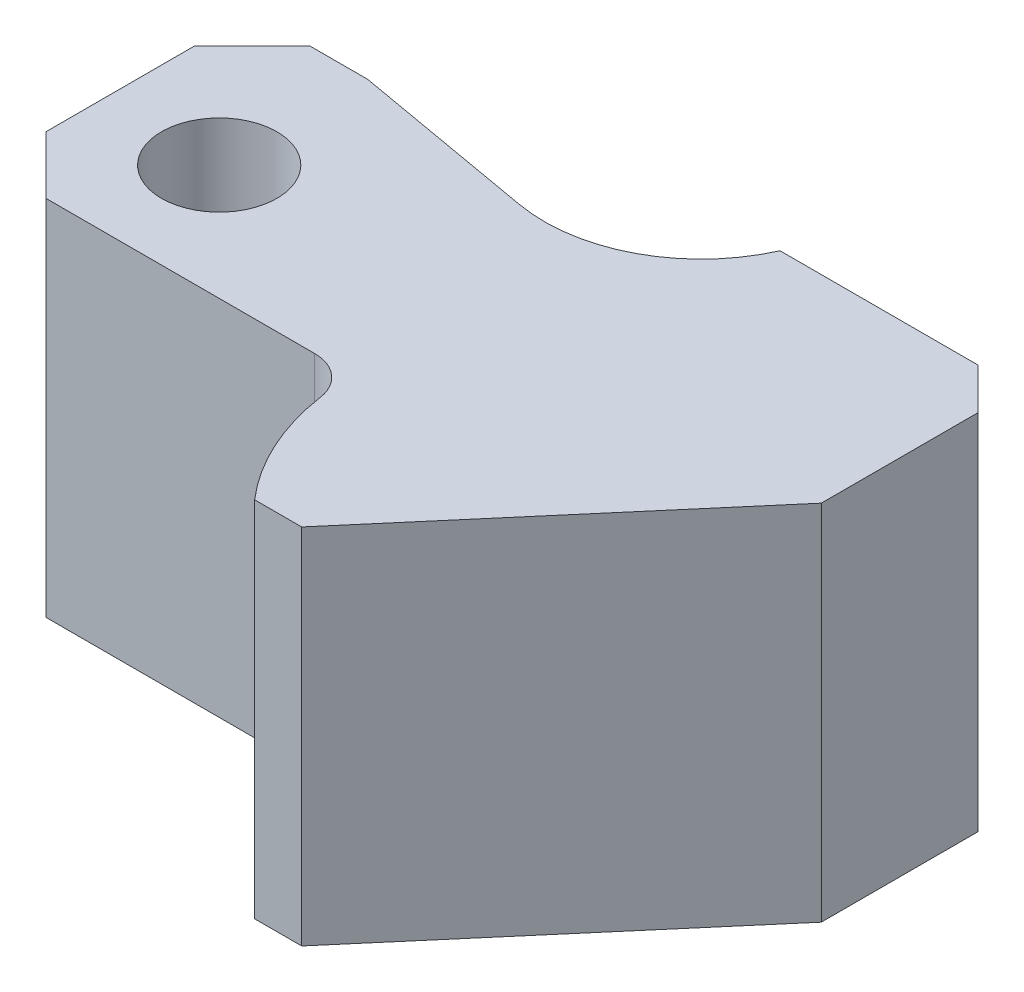
ISO-10303-21;
HEADER;
FILE_DESCRIPTION(('STEP AP214'),'2;1');
FILE_NAME('part.step','',(''),(''),'','','');
FILE_SCHEMA(('AUTOMOTIVE_DESIGN { 1 0 10303 214 1 1 1 1 }'));
ENDSEC;
DATA;
#1=APPLICATION_CONTEXT('core data for automotive mechanical design processes');
#2=APPLICATION_PROTOCOL_DEFINITION('international standard','automotive_design',2000,#1);
#3=PRODUCT_CONTEXT('',#1,'mechanical');
#4=PRODUCT('Part','Part','',(#3));
#5=PRODUCT_RELATED_PRODUCT_CATEGORY('part','',(#4));
#6=PRODUCT_DEFINITION_FORMATION('','',#4);
#7=PRODUCT_DEFINITION_CONTEXT('part definition',#1,'design');
#8=PRODUCT_DEFINITION('design','',#6,#7);
#9=PRODUCT_DEFINITION_SHAPE('','',#8);
#10=(LENGTH_UNIT() NAMED_UNIT(*) SI_UNIT(.MILLI.,.METRE.));
#11=(NAMED_UNIT(*) PLANE_ANGLE_UNIT() SI_UNIT($,.RADIAN.));
#12=(NAMED_UNIT(*) SI_UNIT($,.STERADIAN.) SOLID_ANGLE_UNIT());
#13=UNCERTAINTY_MEASURE_WITH_UNIT(LENGTH_MEASURE(1.E-05),#10,'distance_accuracy_value','');
#14=(GEOMETRIC_REPRESENTATION_CONTEXT(3) GLOBAL_UNCERTAINTY_ASSIGNED_CONTEXT((#13)) GLOBAL_UNIT_ASSIGNED_CONTEXT((#10,
#11,#12)) REPRESENTATION_CONTEXT('',''));
#15=CARTESIAN_POINT('',(0.,0.,0.));
#16=DIRECTION('',(0.,0.,1.));
#17=DIRECTION('',(1.,0.,0.));
#18=AXIS2_PLACEMENT_3D('',#15,#16,#17);
#19=CARTESIAN_POINT('',(31.6158709506115,22.,-36.5570863649439));
#20=DIRECTION('',(0.,1.,0.));
#21=DIRECTION('',(0.,0.,1.));
#22=AXIS2_PLACEMENT_3D('',#19,#20,#21);
#23=PLANE('',#22);
#24=DIRECTION('',(-0.984807753012208,0.,-0.173648177666931));
#25=VECTOR('',#24,1.);
#26=CARTESIAN_POINT('',(5.95517473916279,22.,-21.7886538249566));
#27=LINE('',#26,#25);
#28=CARTESIAN_POINT('',(28.3165555749399,22.,-17.8457390577119));
#29=VERTEX_POINT('',#28);
#30=CARTESIAN_POINT('',(5.95517473916279,22.,-21.7886538249566));
#31=VERTEX_POINT('',#30);
#32=EDGE_CURVE('E203',#29,#31,#27,.T.);
#33=ORIENTED_EDGE('',*,*,#32,.T.);
#34=DIRECTION('',(-1.,0.,0.));
#35=VECTOR('',#34,1.);
#36=CARTESIAN_POINT('',(-1.04482526083724,22.,-21.7886538249566));
#37=LINE('',#36,#35);
#38=CARTESIAN_POINT('',(-1.04482526083724,22.,-21.7886538249566));
#39=VERTEX_POINT('',#38);
#40=EDGE_CURVE('E121',#31,#39,#37,.T.);
#41=ORIENTED_EDGE('',*,*,#40,.T.);
#42=DIRECTION('',(-0.707106781186546,0.,0.707106781186549));
#43=VECTOR('',#42,1.);
#44=CARTESIAN_POINT('',(-8.04482526083721,22.,-14.7886538249566));
#45=LINE('',#44,#43);
#46=CARTESIAN_POINT('',(-8.04482526083721,22.,-14.7886538249566));
#47=VERTEX_POINT('',#46);
#48=EDGE_CURVE('E236',#39,#47,#45,.T.);
#49=ORIENTED_EDGE('',*,*,#48,.T.);
#50=DIRECTION('',(0.,0.,1.));
#51=VECTOR('',#50,1.);
#52=CARTESIAN_POINT('',(-8.04482526083721,22.,3.21134617504336));
#53=LINE('',#52,#51);
#54=CARTESIAN_POINT('',(-8.04482526083721,22.,3.21134617504336));
#55=VERTEX_POINT('',#54);
#56=EDGE_CURVE('E255',#47,#55,#53,.T.);
#57=ORIENTED_EDGE('',*,*,#56,.T.);
#58=DIRECTION('',(0.707106781186546,0.,0.707106781186549));
#59=VECTOR('',#58,1.);
#60=CARTESIAN_POINT('',(-1.04482526083724,22.,10.2113461750434));
#61=LINE('',#60,#59);
#62=CARTESIAN_POINT('',(-1.04482526083724,22.,10.2113461750434));
#63=VERTEX_POINT('',#62);
#64=EDGE_CURVE('E252',#55,#63,#61,.T.);
#65=ORIENTED_EDGE('',*,*,#64,.T.);
#66=DIRECTION('',(1.,0.,0.));
#67=VECTOR('',#66,1.);
#68=CARTESIAN_POINT('',(-1.04482526083724,22.,10.2113461750434));
#69=LINE('',#68,#67);
#70=CARTESIAN_POINT('',(31.5307136505035,22.,10.2113461750434));
#71=VERTEX_POINT('',#70);
#72=EDGE_CURVE('E254',#63,#71,#69,.T.);
#73=ORIENTED_EDGE('',*,*,#72,.T.);
#74=CARTESIAN_POINT('',(31.5307136505035,22.,15.2113461750434));
#75=DIRECTION('',(0.,-1.,0.));
#76=DIRECTION('',(0.,0.,-1.));
#77=AXIS2_PLACEMENT_3D('',#74,#75,#76);
#78=CIRCLE('',#77,5.);
#79=CARTESIAN_POINT('',(36.4763523919153,22.,14.4760520573963));
#80=VERTEX_POINT('',#79);
#81=EDGE_CURVE('E257',#71,#80,#78,.T.);
#82=ORIENTED_EDGE('',*,*,#81,.T.);
#83=CARTESIAN_POINT('',(65.1610570921039,22.,10.2113461750434));
#84=DIRECTION('',(0.,1.,0.));
#85=DIRECTION('',(0.,0.,1.));
#86=AXIS2_PLACEMENT_3D('',#83,#84,#85);
#87=CIRCLE('',#86,29.);
#88=CARTESIAN_POINT('',(43.2521547918973,22.,29.2113461750434));
#89=VERTEX_POINT('',#88);
#90=EDGE_CURVE('E263',#80,#89,#87,.T.);
#91=ORIENTED_EDGE('',*,*,#90,.T.);
#92=DIRECTION('',(1.,0.,0.));
#93=VECTOR('',#92,1.);
#94=CARTESIAN_POINT('',(43.2521547918973,22.,29.2113461750434));
#95=LINE('',#94,#93);
#96=CARTESIAN_POINT('',(48.9551747391628,22.,29.2113461750434));
#97=VERTEX_POINT('',#96);
#98=EDGE_CURVE('E265',#89,#97,#95,.T.);
#99=ORIENTED_EDGE('',*,*,#98,.T.);
#100=DIRECTION('',(0.64894660608275,0.,-0.760833951959086));
#101=VECTOR('',#100,1.);
#102=CARTESIAN_POINT('',(48.9551747391628,22.,29.2113461750434));
#103=LINE('',#102,#101);
#104=CARTESIAN_POINT('',(77.9551747391628,22.,-4.78865382495664));
#105=VERTEX_POINT('',#104);
#106=EDGE_CURVE('E267',#97,#105,#103,.T.);
#107=ORIENTED_EDGE('',*,*,#106,.T.);
#108=DIRECTION('',(0.,0.,-1.));
#109=VECTOR('',#108,1.);
#110=CARTESIAN_POINT('',(77.9551747391628,22.,-23.7886538249566));
#111=LINE('',#110,#109);
#112=CARTESIAN_POINT('',(77.9551747391628,22.,-23.7886538249566));
#113=VERTEX_POINT('',#112);
#114=EDGE_CURVE('E158',#105,#113,#111,.T.);
#115=ORIENTED_EDGE('',*,*,#114,.T.);
#116=DIRECTION('',(-0.707106781186548,0.,-0.707106781186547));
#117=VECTOR('',#116,1.);
#118=CARTESIAN_POINT('',(72.9551747391628,22.,-28.7886538249566));
#119=LINE('',#118,#117);
#120=CARTESIAN_POINT('',(72.9551747391628,22.,-28.7886538249566));
#121=VERTEX_POINT('',#120);
#122=EDGE_CURVE('E152',#113,#121,#119,.T.);
#123=ORIENTED_EDGE('',*,*,#122,.T.);
#124=DIRECTION('',(-1.,0.,0.));
#125=VECTOR('',#124,1.);
#126=CARTESIAN_POINT('',(48.9551747391628,22.,-28.7886538249566));
#127=LINE('',#126,#125);
#128=CARTESIAN_POINT('',(48.9551747391628,22.,-28.7886538249566));
#129=VERTEX_POINT('',#128);
#130=EDGE_CURVE('E156',#121,#129,#127,.T.);
#131=ORIENTED_EDGE('',*,*,#130,.T.);
#132=CARTESIAN_POINT('',(31.6158709506115,22.,-36.5570863649439));
#133=DIRECTION('',(0.,-1.,0.));
#134=DIRECTION('',(0.,0.,1.));
#135=AXIS2_PLACEMENT_3D('',#132,#133,#134);
#136=CIRCLE('',#135,19.);
#137=EDGE_CURVE('E60',#129,#29,#136,.T.);
#138=ORIENTED_EDGE('',*,*,#137,.T.);
#139=EDGE_LOOP('',(#33,#41,#49,#57,#65,#73,#82,#91,#99,#107,#115,#123,#131,#138));
#140=FACE_BOUND('',#139,.T.);
#141=CARTESIAN_POINT('',(5.95517473916279,22.,-3.78865382495664));
#142=DIRECTION('',(0.,1.,0.));
#143=DIRECTION('',(0.,0.,1.));
#144=AXIS2_PLACEMENT_3D('',#141,#142,#143);
#145=CIRCLE('',#144,7.);
#146=CARTESIAN_POINT('',(5.95517473916279,22.,3.21134617504336));
#147=VERTEX_POINT('',#146);
#148=EDGE_CURVE('E180',#147,#147,#145,.T.);
#149=ORIENTED_EDGE('',*,*,#148,.F.);
#150=EDGE_LOOP('',(#149));
#151=FACE_BOUND('',#150,.T.);
#152=ADVANCED_FACE('F43',(#140,#151),#23,.T.);
#153=CARTESIAN_POINT('',(31.6158709506115,-22.,-36.5570863649439));
#154=DIRECTION('',(0.,1.,0.));
#155=DIRECTION('',(0.,0.,1.));
#156=AXIS2_PLACEMENT_3D('',#153,#154,#155);
#157=PLANE('',#156);
#158=DIRECTION('',(-0.984807753012208,0.,-0.173648177666931));
#159=VECTOR('',#158,1.);
#160=CARTESIAN_POINT('',(5.95517473916279,-22.,-21.7886538249566));
#161=LINE('',#160,#159);
#162=CARTESIAN_POINT('',(28.3165555749399,-22.,-17.8457390577119));
#163=VERTEX_POINT('',#162);
#164=CARTESIAN_POINT('',(5.95517473916279,-22.,-21.7886538249566));
#165=VERTEX_POINT('',#164);
#166=EDGE_CURVE('E176',#163,#165,#161,.T.);
#167=ORIENTED_EDGE('',*,*,#166,.F.);
#168=CARTESIAN_POINT('',(31.6158709506115,-22.,-36.5570863649439));
#169=DIRECTION('',(0.,-1.,0.));
#170=DIRECTION('',(0.,0.,1.));
#171=AXIS2_PLACEMENT_3D('',#168,#169,#170);
#172=CIRCLE('',#171,19.);
#173=CARTESIAN_POINT('',(48.9551747391628,-22.,-28.7886538249566));
#174=VERTEX_POINT('',#173);
#175=EDGE_CURVE('E113',#174,#163,#172,.T.);
#176=ORIENTED_EDGE('',*,*,#175,.F.);
#177=DIRECTION('',(-1.,0.,0.));
#178=VECTOR('',#177,1.);
#179=CARTESIAN_POINT('',(48.9551747391628,-22.,-28.7886538249566));
#180=LINE('',#179,#178);
#181=CARTESIAN_POINT('',(72.9551747391628,-22.,-28.7886538249566));
#182=VERTEX_POINT('',#181);
#183=EDGE_CURVE('E107',#182,#174,#180,.T.);
#184=ORIENTED_EDGE('',*,*,#183,.F.);
#185=DIRECTION('',(-0.707106781186548,0.,-0.707106781186547));
#186=VECTOR('',#185,1.);
#187=CARTESIAN_POINT('',(72.9551747391628,-22.,-28.7886538249566));
#188=LINE('',#187,#186);
#189=CARTESIAN_POINT('',(77.9551747391628,-22.,-23.7886538249566));
#190=VERTEX_POINT('',#189);
#191=EDGE_CURVE('E166',#190,#182,#188,.T.);
#192=ORIENTED_EDGE('',*,*,#191,.F.);
#193=DIRECTION('',(0.,0.,-1.));
#194=VECTOR('',#193,1.);
#195=CARTESIAN_POINT('',(77.9551747391628,-22.,-23.7886538249566));
#196=LINE('',#195,#194);
#197=CARTESIAN_POINT('',(77.9551747391628,-22.,-4.78865382495664));
#198=VERTEX_POINT('',#197);
#199=EDGE_CURVE('E198',#198,#190,#196,.T.);
#200=ORIENTED_EDGE('',*,*,#199,.F.);
#201=DIRECTION('',(0.64894660608275,0.,-0.760833951959086));
#202=VECTOR('',#201,1.);
#203=CARTESIAN_POINT('',(48.9551747391628,-22.,29.2113461750434));
#204=LINE('',#203,#202);
#205=CARTESIAN_POINT('',(48.9551747391628,-22.,29.2113461750434));
#206=VERTEX_POINT('',#205);
#207=EDGE_CURVE('E196',#206,#198,#204,.T.);
#208=ORIENTED_EDGE('',*,*,#207,.F.);
#209=DIRECTION('',(1.,0.,0.));
#210=VECTOR('',#209,1.);
#211=CARTESIAN_POINT('',(43.2521547918973,-22.,29.2113461750434));
#212=LINE('',#211,#210);
#213=CARTESIAN_POINT('',(43.2521547918973,-22.,29.2113461750434));
#214=VERTEX_POINT('',#213);
#215=EDGE_CURVE('E194',#214,#206,#212,.T.);
#216=ORIENTED_EDGE('',*,*,#215,.F.);
#217=CARTESIAN_POINT('',(65.1610570921039,-22.,10.2113461750434));
#218=DIRECTION('',(0.,1.,0.));
#219=DIRECTION('',(0.,0.,1.));
#220=AXIS2_PLACEMENT_3D('',#217,#218,#219);
#221=CIRCLE('',#220,29.);
#222=CARTESIAN_POINT('',(36.4763523919153,-22.,14.4760520573963));
#223=VERTEX_POINT('',#222);
#224=EDGE_CURVE('E192',#223,#214,#221,.T.);
#225=ORIENTED_EDGE('',*,*,#224,.F.);
#226=CARTESIAN_POINT('',(31.5307136505035,-22.,15.2113461750434));
#227=DIRECTION('',(0.,-1.,0.));
#228=DIRECTION('',(0.,0.,-1.));
#229=AXIS2_PLACEMENT_3D('',#226,#227,#228);
#230=CIRCLE('',#229,5.);
#231=CARTESIAN_POINT('',(31.5307136505035,-22.,10.2113461750434));
#232=VERTEX_POINT('',#231);
#233=EDGE_CURVE('E190',#232,#223,#230,.T.);
#234=ORIENTED_EDGE('',*,*,#233,.F.);
#235=DIRECTION('',(1.,0.,0.));
#236=VECTOR('',#235,1.);
#237=CARTESIAN_POINT('',(-1.04482526083724,-22.,10.2113461750434));
#238=LINE('',#237,#236);
#239=CARTESIAN_POINT('',(-1.04482526083724,-22.,10.2113461750434));
#240=VERTEX_POINT('',#239);
#241=EDGE_CURVE('E188',#240,#232,#238,.T.);
#242=ORIENTED_EDGE('',*,*,#241,.F.);
#243=DIRECTION('',(0.707106781186546,0.,0.707106781186549));
#244=VECTOR('',#243,1.);
#245=CARTESIAN_POINT('',(-1.04482526083724,-22.,10.2113461750434));
#246=LINE('',#245,#244);
#247=CARTESIAN_POINT('',(-8.04482526083721,-22.,3.21134617504336));
#248=VERTEX_POINT('',#247);
#249=EDGE_CURVE('E186',#248,#240,#246,.T.);
#250=ORIENTED_EDGE('',*,*,#249,.F.);
#251=DIRECTION('',(0.,0.,1.));
#252=VECTOR('',#251,1.);
#253=CARTESIAN_POINT('',(-8.04482526083721,-22.,3.21134617504336));
#254=LINE('',#253,#252);
#255=CARTESIAN_POINT('',(-8.04482526083721,-22.,-14.7886538249566));
#256=VERTEX_POINT('',#255);
#257=EDGE_CURVE('E184',#256,#248,#254,.T.);
#258=ORIENTED_EDGE('',*,*,#257,.F.);
#259=DIRECTION('',(-0.707106781186546,0.,0.707106781186549));
#260=VECTOR('',#259,1.);
#261=CARTESIAN_POINT('',(-8.04482526083721,-22.,-14.7886538249566));
#262=LINE('',#261,#260);
#263=CARTESIAN_POINT('',(-1.04482526083724,-22.,-21.7886538249566));
#264=VERTEX_POINT('',#263);
#265=EDGE_CURVE('E182',#264,#256,#262,.T.);
#266=ORIENTED_EDGE('',*,*,#265,.F.);
#267=DIRECTION('',(-1.,0.,0.));
#268=VECTOR('',#267,1.);
#269=CARTESIAN_POINT('',(-1.04482526083724,-22.,-21.7886538249566));
#270=LINE('',#269,#268);
#271=EDGE_CURVE('E179',#165,#264,#270,.T.);
#272=ORIENTED_EDGE('',*,*,#271,.F.);
#273=EDGE_LOOP('',(#167,#176,#184,#192,#200,#208,#216,#225,#234,#242,#250,#258,#266,#272));
#274=FACE_BOUND('',#273,.T.);
#275=CARTESIAN_POINT('',(5.95517473916279,-22.,-3.78865382495664));
#276=DIRECTION('',(0.,1.,0.));
#277=DIRECTION('',(0.,0.,1.));
#278=AXIS2_PLACEMENT_3D('',#275,#276,#277);
#279=CIRCLE('',#278,7.);
#280=CARTESIAN_POINT('',(5.95517473916279,-22.,3.21134617504336));
#281=VERTEX_POINT('',#280);
#282=EDGE_CURVE('E440',#281,#281,#279,.T.);
#283=ORIENTED_EDGE('',*,*,#282,.T.);
#284=EDGE_LOOP('',(#283));
#285=FACE_BOUND('',#284,.T.);
#286=ADVANCED_FACE('F240',(#274,#285),#157,.F.);
#287=CARTESIAN_POINT('',(5.95517473916279,22.,-21.7886538249566));
#288=DIRECTION('',(-0.173648177666931,0.,0.984807753012208));
#289=DIRECTION('',(0.984807753012208,0.,0.173648177666931));
#290=AXIS2_PLACEMENT_3D('',#287,#288,#289);
#291=PLANE('',#290);
#292=ORIENTED_EDGE('',*,*,#166,.T.);
#293=DIRECTION('',(0.,-1.,0.));
#294=VECTOR('',#293,1.);
#295=CARTESIAN_POINT('',(5.95517473916279,22.,-21.7886538249566));
#296=LINE('',#295,#294);
#297=EDGE_CURVE('E11',#31,#165,#296,.T.);
#298=ORIENTED_EDGE('',*,*,#297,.F.);
#299=ORIENTED_EDGE('',*,*,#32,.F.);
#300=DIRECTION('',(0.,-1.,0.));
#301=VECTOR('',#300,1.);
#302=CARTESIAN_POINT('',(28.3165555749399,22.,-17.8457390577119));
#303=LINE('',#302,#301);
#304=EDGE_CURVE('E172',#29,#163,#303,.T.);
#305=ORIENTED_EDGE('',*,*,#304,.T.);
#306=EDGE_LOOP('',(#292,#298,#299,#305));
#307=FACE_BOUND('',#306,.T.);
#308=ADVANCED_FACE('F45',(#307),#291,.F.);
#309=CARTESIAN_POINT('',(-1.04482526083724,22.,-21.7886538249566));
#310=DIRECTION('',(0.,0.,1.));
#311=DIRECTION('',(1.,0.,0.));
#312=AXIS2_PLACEMENT_3D('',#309,#310,#311);
#313=PLANE('',#312);
#314=ORIENTED_EDGE('',*,*,#271,.T.);
#315=DIRECTION('',(0.,-1.,0.));
#316=VECTOR('',#315,1.);
#317=CARTESIAN_POINT('',(-1.04482526083724,22.,-21.7886538249566));
#318=LINE('',#317,#316);
#319=EDGE_CURVE('E52',#39,#264,#318,.T.);
#320=ORIENTED_EDGE('',*,*,#319,.F.);
#321=ORIENTED_EDGE('',*,*,#40,.F.);
#322=ORIENTED_EDGE('',*,*,#297,.T.);
#323=EDGE_LOOP('',(#314,#320,#321,#322));
#324=FACE_BOUND('',#323,.T.);
#325=ADVANCED_FACE('F301',(#324),#313,.F.);
#326=CARTESIAN_POINT('',(-8.04482526083721,22.,-14.7886538249566));
#327=DIRECTION('',(0.707106781186549,0.,0.707106781186546));
#328=DIRECTION('',(0.707106781186546,0.,-0.707106781186549));
#329=AXIS2_PLACEMENT_3D('',#326,#327,#328);
#330=PLANE('',#329);
#331=ORIENTED_EDGE('',*,*,#265,.T.);
#332=DIRECTION('',(0.,-1.,0.));
#333=VECTOR('',#332,1.);
#334=CARTESIAN_POINT('',(-8.04482526083721,22.,-14.7886538249566));
#335=LINE('',#334,#333);
#336=EDGE_CURVE('E228',#47,#256,#335,.T.);
#337=ORIENTED_EDGE('',*,*,#336,.F.);
#338=ORIENTED_EDGE('',*,*,#48,.F.);
#339=ORIENTED_EDGE('',*,*,#319,.T.);
#340=EDGE_LOOP('',(#331,#337,#338,#339));
#341=FACE_BOUND('',#340,.T.);
#342=ADVANCED_FACE('F234',(#341),#330,.F.);
#343=CARTESIAN_POINT('',(-8.04482526083721,22.,3.21134617504336));
#344=DIRECTION('',(1.,0.,0.));
#345=DIRECTION('',(0.,0.,-1.));
#346=AXIS2_PLACEMENT_3D('',#343,#344,#345);
#347=PLANE('',#346);
#348=ORIENTED_EDGE('',*,*,#257,.T.);
#349=DIRECTION('',(0.,-1.,0.));
#350=VECTOR('',#349,1.);
#351=CARTESIAN_POINT('',(-8.04482526083721,22.,3.21134617504336));
#352=LINE('',#351,#350);
#353=EDGE_CURVE('E225',#55,#248,#352,.T.);
#354=ORIENTED_EDGE('',*,*,#353,.F.);
#355=ORIENTED_EDGE('',*,*,#56,.F.);
#356=ORIENTED_EDGE('',*,*,#336,.T.);
#357=EDGE_LOOP('',(#348,#354,#355,#356));
#358=FACE_BOUND('',#357,.T.);
#359=ADVANCED_FACE('F246',(#358),#347,.F.);
#360=CARTESIAN_POINT('',(-1.04482526083724,22.,10.2113461750434));
#361=DIRECTION('',(0.707106781186549,0.,-0.707106781186546));
#362=DIRECTION('',(-0.707106781186546,0.,-0.707106781186549));
#363=AXIS2_PLACEMENT_3D('',#360,#361,#362);
#364=PLANE('',#363);
#365=ORIENTED_EDGE('',*,*,#249,.T.);
#366=DIRECTION('',(0.,-1.,0.));
#367=VECTOR('',#366,1.);
#368=CARTESIAN_POINT('',(-1.04482526083724,22.,10.2113461750434));
#369=LINE('',#368,#367);
#370=EDGE_CURVE('E222',#63,#240,#369,.T.);
#371=ORIENTED_EDGE('',*,*,#370,.F.);
#372=ORIENTED_EDGE('',*,*,#64,.F.);
#373=ORIENTED_EDGE('',*,*,#353,.T.);
#374=EDGE_LOOP('',(#365,#371,#372,#373));
#375=FACE_BOUND('',#374,.T.);
#376=ADVANCED_FACE('F250',(#375),#364,.F.);
#377=CARTESIAN_POINT('',(-1.04482526083724,22.,10.2113461750434));
#378=DIRECTION('',(0.,0.,-1.));
#379=DIRECTION('',(-1.,0.,0.));
#380=AXIS2_PLACEMENT_3D('',#377,#378,#379);
#381=PLANE('',#380);
#382=ORIENTED_EDGE('',*,*,#241,.T.);
#383=DIRECTION('',(0.,-1.,0.));
#384=VECTOR('',#383,1.);
#385=CARTESIAN_POINT('',(31.5307136505035,22.,10.2113461750434));
#386=LINE('',#385,#384);
#387=EDGE_CURVE('E219',#71,#232,#386,.T.);
#388=ORIENTED_EDGE('',*,*,#387,.F.);
#389=ORIENTED_EDGE('',*,*,#72,.F.);
#390=ORIENTED_EDGE('',*,*,#370,.T.);
#391=EDGE_LOOP('',(#382,#388,#389,#390));
#392=FACE_BOUND('',#391,.T.);
#393=ADVANCED_FACE('F314',(#392),#381,.F.);
#394=CARTESIAN_POINT('',(31.5307136505035,22.,15.2113461750434));
#395=DIRECTION('',(0.,-1.,0.));
#396=DIRECTION('',(0.,0.,-1.));
#397=AXIS2_PLACEMENT_3D('',#394,#395,#396);
#398=CYLINDRICAL_SURFACE('',#397,5.);
#399=ORIENTED_EDGE('',*,*,#233,.T.);
#400=DIRECTION('',(0.,-1.,0.));
#401=VECTOR('',#400,1.);
#402=CARTESIAN_POINT('',(36.4763523919153,22.,14.4760520573963));
#403=LINE('',#402,#401);
#404=EDGE_CURVE('E216',#80,#223,#403,.T.);
#405=ORIENTED_EDGE('',*,*,#404,.F.);
#406=ORIENTED_EDGE('',*,*,#81,.F.);
#407=ORIENTED_EDGE('',*,*,#387,.T.);
#408=EDGE_LOOP('',(#399,#405,#406,#407));
#409=FACE_BOUND('',#408,.T.);
#410=ADVANCED_FACE('F317',(#409),#398,.F.);
#411=CARTESIAN_POINT('',(65.1610570921039,22.,10.2113461750434));
#412=DIRECTION('',(0.,-1.,0.));
#413=DIRECTION('',(0.,0.,-1.));
#414=AXIS2_PLACEMENT_3D('',#411,#412,#413);
#415=CYLINDRICAL_SURFACE('',#414,29.);
#416=ORIENTED_EDGE('',*,*,#224,.T.);
#417=DIRECTION('',(0.,-1.,0.));
#418=VECTOR('',#417,1.);
#419=CARTESIAN_POINT('',(43.2521547918973,22.,29.2113461750434));
#420=LINE('',#419,#418);
#421=EDGE_CURVE('E213',#89,#214,#420,.T.);
#422=ORIENTED_EDGE('',*,*,#421,.F.);
#423=ORIENTED_EDGE('',*,*,#90,.F.);
#424=ORIENTED_EDGE('',*,*,#404,.T.);
#425=EDGE_LOOP('',(#416,#422,#423,#424));
#426=FACE_BOUND('',#425,.T.);
#427=ADVANCED_FACE('F321',(#426),#415,.T.);
#428=CARTESIAN_POINT('',(43.2521547918973,22.,29.2113461750434));
#429=DIRECTION('',(0.,0.,-1.));
#430=DIRECTION('',(-1.,0.,0.));
#431=AXIS2_PLACEMENT_3D('',#428,#429,#430);
#432=PLANE('',#431);
#433=ORIENTED_EDGE('',*,*,#215,.T.);
#434=DIRECTION('',(0.,-1.,0.));
#435=VECTOR('',#434,1.);
#436=CARTESIAN_POINT('',(48.9551747391628,22.,29.2113461750434));
#437=LINE('',#436,#435);
#438=EDGE_CURVE('E210',#97,#206,#437,.T.);
#439=ORIENTED_EDGE('',*,*,#438,.F.);
#440=ORIENTED_EDGE('',*,*,#98,.F.);
#441=ORIENTED_EDGE('',*,*,#421,.T.);
#442=EDGE_LOOP('',(#433,#439,#440,#441));
#443=FACE_BOUND('',#442,.T.);
#444=ADVANCED_FACE('F325',(#443),#432,.F.);
#445=CARTESIAN_POINT('',(48.9551747391628,22.,29.2113461750434));
#446=DIRECTION('',(-0.760833951959086,0.,-0.64894660608275));
#447=DIRECTION('',(-0.64894660608275,0.,0.760833951959086));
#448=AXIS2_PLACEMENT_3D('',#445,#446,#447);
#449=PLANE('',#448);
#450=ORIENTED_EDGE('',*,*,#207,.T.);
#451=DIRECTION('',(0.,-1.,0.));
#452=VECTOR('',#451,1.);
#453=CARTESIAN_POINT('',(77.9551747391628,22.,-4.78865382495664));
#454=LINE('',#453,#452);
#455=EDGE_CURVE('E207',#105,#198,#454,.T.);
#456=ORIENTED_EDGE('',*,*,#455,.F.);
#457=ORIENTED_EDGE('',*,*,#106,.F.);
#458=ORIENTED_EDGE('',*,*,#438,.T.);
#459=EDGE_LOOP('',(#450,#456,#457,#458));
#460=FACE_BOUND('',#459,.T.);
#461=ADVANCED_FACE('F273',(#460),#449,.F.);
#462=CARTESIAN_POINT('',(77.9551747391628,22.,-23.7886538249566));
#463=DIRECTION('',(-1.,0.,0.));
#464=DIRECTION('',(0.,0.,1.));
#465=AXIS2_PLACEMENT_3D('',#462,#463,#464);
#466=PLANE('',#465);
#467=ORIENTED_EDGE('',*,*,#199,.T.);
#468=DIRECTION('',(0.,-1.,0.));
#469=VECTOR('',#468,1.);
#470=CARTESIAN_POINT('',(77.9551747391628,22.,-23.7886538249566));
#471=LINE('',#470,#469);
#472=EDGE_CURVE('E167',#113,#190,#471,.T.);
#473=ORIENTED_EDGE('',*,*,#472,.F.);
#474=ORIENTED_EDGE('',*,*,#114,.F.);
#475=ORIENTED_EDGE('',*,*,#455,.T.);
#476=EDGE_LOOP('',(#467,#473,#474,#475));
#477=FACE_BOUND('',#476,.T.);
#478=ADVANCED_FACE('F277',(#477),#466,.F.);
#479=CARTESIAN_POINT('',(72.9551747391628,22.,-28.7886538249566));
#480=DIRECTION('',(-0.707106781186547,0.,0.707106781186548));
#481=DIRECTION('',(0.707106781186548,0.,0.707106781186547));
#482=AXIS2_PLACEMENT_3D('',#479,#480,#481);
#483=PLANE('',#482);
#484=ORIENTED_EDGE('',*,*,#191,.T.);
#485=DIRECTION('',(0.,-1.,0.));
#486=VECTOR('',#485,1.);
#487=CARTESIAN_POINT('',(72.9551747391628,22.,-28.7886538249566));
#488=LINE('',#487,#486);
#489=EDGE_CURVE('E163',#121,#182,#488,.T.);
#490=ORIENTED_EDGE('',*,*,#489,.F.);
#491=ORIENTED_EDGE('',*,*,#122,.F.);
#492=ORIENTED_EDGE('',*,*,#472,.T.);
#493=EDGE_LOOP('',(#484,#490,#491,#492));
#494=FACE_BOUND('',#493,.T.);
#495=ADVANCED_FACE('F164',(#494),#483,.F.);
#496=CARTESIAN_POINT('',(48.9551747391628,22.,-28.7886538249566));
#497=DIRECTION('',(0.,0.,1.));
#498=DIRECTION('',(1.,0.,0.));
#499=AXIS2_PLACEMENT_3D('',#496,#497,#498);
#500=PLANE('',#499);
#501=ORIENTED_EDGE('',*,*,#183,.T.);
#502=DIRECTION('',(0.,-1.,0.));
#503=VECTOR('',#502,1.);
#504=CARTESIAN_POINT('',(48.9551747391628,22.,-28.7886538249566));
#505=LINE('',#504,#503);
#506=EDGE_CURVE('E168',#129,#174,#505,.T.);
#507=ORIENTED_EDGE('',*,*,#506,.F.);
#508=ORIENTED_EDGE('',*,*,#130,.F.);
#509=ORIENTED_EDGE('',*,*,#489,.T.);
#510=EDGE_LOOP('',(#501,#507,#508,#509));
#511=FACE_BOUND('',#510,.T.);
#512=ADVANCED_FACE('F170',(#511),#500,.F.);
#513=CARTESIAN_POINT('',(31.6158709506115,22.,-36.5570863649439));
#514=DIRECTION('',(0.,-1.,0.));
#515=DIRECTION('',(0.,0.,-1.));
#516=AXIS2_PLACEMENT_3D('',#513,#514,#515);
#517=CYLINDRICAL_SURFACE('',#516,19.);
#518=ORIENTED_EDGE('',*,*,#175,.T.);
#519=ORIENTED_EDGE('',*,*,#304,.F.);
#520=ORIENTED_EDGE('',*,*,#137,.F.);
#521=ORIENTED_EDGE('',*,*,#506,.T.);
#522=EDGE_LOOP('',(#518,#519,#520,#521));
#523=FACE_BOUND('',#522,.T.);
#524=ADVANCED_FACE('F281',(#523),#517,.F.);
#525=CARTESIAN_POINT('',(5.95517473916279,22.,-3.78865382495664));
#526=DIRECTION('',(0.,-1.,0.));
#527=DIRECTION('',(0.,0.,-1.));
#528=AXIS2_PLACEMENT_3D('',#525,#526,#527);
#529=CYLINDRICAL_SURFACE('',#528,7.);
#530=ORIENTED_EDGE('',*,*,#148,.T.);
#531=EDGE_LOOP('',(#530));
#532=FACE_BOUND('',#531,.T.);
#533=ORIENTED_EDGE('',*,*,#282,.F.);
#534=EDGE_LOOP('',(#533));
#535=FACE_BOUND('',#534,.T.);
#536=ADVANCED_FACE('F283',(#532,#535),#529,.F.);
#537=CLOSED_SHELL('',(#152,#286,#308,#325,#342,#359,#376,#393,#410,#427,#444,#461,#478,#495,
#512,#524,#536));
#538=MANIFOLD_SOLID_BREP('B2',#537);
#539=ADVANCED_BREP_SHAPE_REPRESENTATION('',(#18,#538),#14);
#540=SHAPE_DEFINITION_REPRESENTATION(#9,#539);
ENDSEC;
END-ISO-10303-21;
